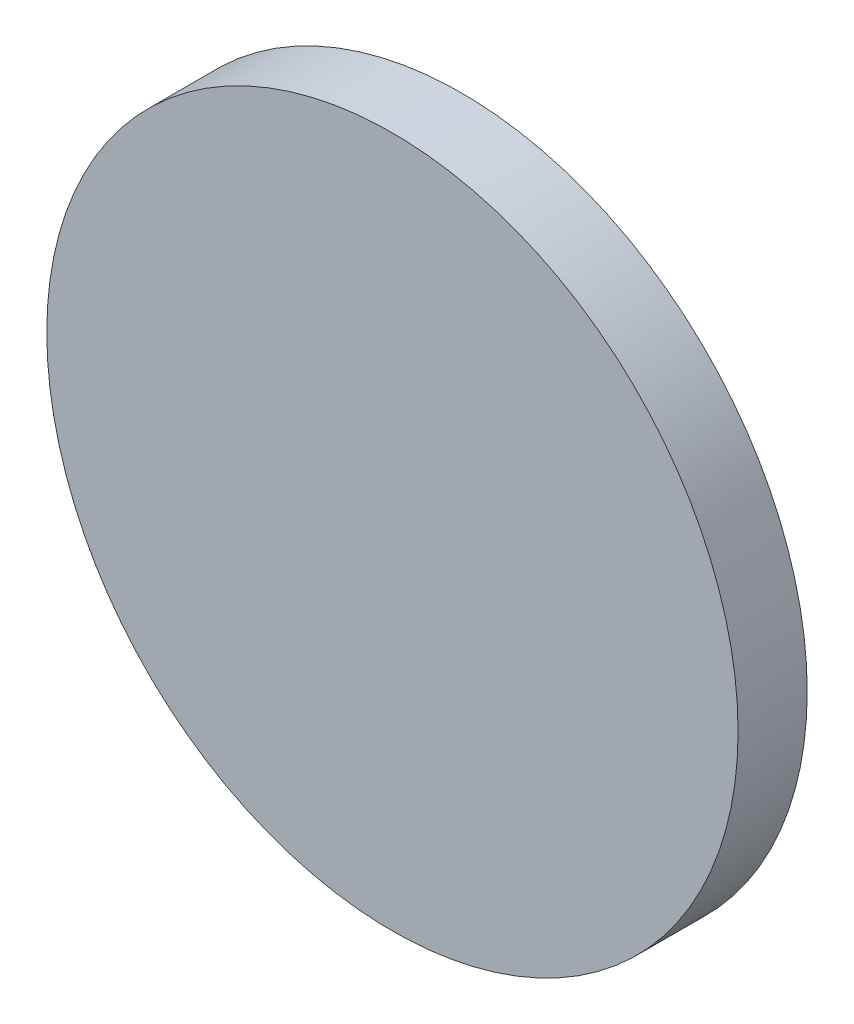
ISO-10303-21;
HEADER;
FILE_DESCRIPTION(('STEP AP214'),'2;1');
FILE_NAME('part.step','',(''),(''),'','','');
FILE_SCHEMA(('AUTOMOTIVE_DESIGN { 1 0 10303 214 1 1 1 1 }'));
ENDSEC;
DATA;
#1=APPLICATION_CONTEXT('core data for automotive mechanical design processes');
#2=APPLICATION_PROTOCOL_DEFINITION('international standard','automotive_design',2000,#1);
#3=PRODUCT_CONTEXT('',#1,'mechanical');
#4=PRODUCT('Part','Part','',(#3));
#5=PRODUCT_RELATED_PRODUCT_CATEGORY('part','',(#4));
#6=PRODUCT_DEFINITION_FORMATION('','',#4);
#7=PRODUCT_DEFINITION_CONTEXT('part definition',#1,'design');
#8=PRODUCT_DEFINITION('design','',#6,#7);
#9=PRODUCT_DEFINITION_SHAPE('','',#8);
#10=(LENGTH_UNIT() NAMED_UNIT(*) SI_UNIT(.MILLI.,.METRE.));
#11=(NAMED_UNIT(*) PLANE_ANGLE_UNIT() SI_UNIT($,.RADIAN.));
#12=(NAMED_UNIT(*) SI_UNIT($,.STERADIAN.) SOLID_ANGLE_UNIT());
#13=UNCERTAINTY_MEASURE_WITH_UNIT(LENGTH_MEASURE(1.E-05),#10,'distance_accuracy_value','');
#14=(GEOMETRIC_REPRESENTATION_CONTEXT(3) GLOBAL_UNCERTAINTY_ASSIGNED_CONTEXT((#13)) GLOBAL_UNIT_ASSIGNED_CONTEXT((#10,
#11,#12)) REPRESENTATION_CONTEXT('',''));
#15=CARTESIAN_POINT('',(0.,0.,0.));
#16=DIRECTION('',(0.,0.,1.));
#17=DIRECTION('',(1.,0.,0.));
#18=AXIS2_PLACEMENT_3D('',#15,#16,#17);
#19=CARTESIAN_POINT('',(0.,0.,100.55));
#20=DIRECTION('',(0.,0.,1.));
#21=DIRECTION('',(1.,0.,0.));
#22=AXIS2_PLACEMENT_3D('',#19,#20,#21);
#23=CYLINDRICAL_SURFACE('',#22,50.);
#24=CARTESIAN_POINT('',(0.,0.,100.55));
#25=DIRECTION('',(0.,0.,1.));
#26=DIRECTION('',(1.,0.,0.));
#27=AXIS2_PLACEMENT_3D('',#24,#25,#26);
#28=CIRCLE('',#27,50.);
#29=CARTESIAN_POINT('',(50.,0.,100.55));
#30=VERTEX_POINT('',#29);
#31=EDGE_CURVE('E10',#30,#30,#28,.T.);
#32=ORIENTED_EDGE('',*,*,#31,.T.);
#33=EDGE_LOOP('',(#32));
#34=FACE_BOUND('',#33,.T.);
#35=CARTESIAN_POINT('',(0.,0.,110.55));
#36=DIRECTION('',(0.,0.,1.));
#37=DIRECTION('',(1.,0.,0.));
#38=AXIS2_PLACEMENT_3D('',#35,#36,#37);
#39=CIRCLE('',#38,50.);
#40=CARTESIAN_POINT('',(50.,0.,110.55));
#41=VERTEX_POINT('',#40);
#42=EDGE_CURVE('E42',#41,#41,#39,.T.);
#43=ORIENTED_EDGE('',*,*,#42,.F.);
#44=EDGE_LOOP('',(#43));
#45=FACE_BOUND('',#44,.T.);
#46=ADVANCED_FACE('F39',(#34,#45),#23,.T.);
#47=CARTESIAN_POINT('',(0.,0.,100.55));
#48=DIRECTION('',(0.,0.,1.));
#49=DIRECTION('',(1.,0.,0.));
#50=AXIS2_PLACEMENT_3D('',#47,#48,#49);
#51=PLANE('',#50);
#52=ORIENTED_EDGE('',*,*,#31,.F.);
#53=EDGE_LOOP('',(#52));
#54=FACE_BOUND('',#53,.T.);
#55=ADVANCED_FACE('F54',(#54),#51,.F.);
#56=CARTESIAN_POINT('',(0.,0.,110.55));
#57=DIRECTION('',(0.,0.,1.));
#58=DIRECTION('',(1.,0.,0.));
#59=AXIS2_PLACEMENT_3D('',#56,#57,#58);
#60=PLANE('',#59);
#61=ORIENTED_EDGE('',*,*,#42,.T.);
#62=EDGE_LOOP('',(#61));
#63=FACE_BOUND('',#62,.T.);
#64=ADVANCED_FACE('F51',(#63),#60,.T.);
#65=CLOSED_SHELL('',(#46,#55,#64));
#66=MANIFOLD_SOLID_BREP('B2',#65);
#67=ADVANCED_BREP_SHAPE_REPRESENTATION('',(#18,#66),#14);
#68=SHAPE_DEFINITION_REPRESENTATION(#9,#67);
ENDSEC;
END-ISO-10303-21;
